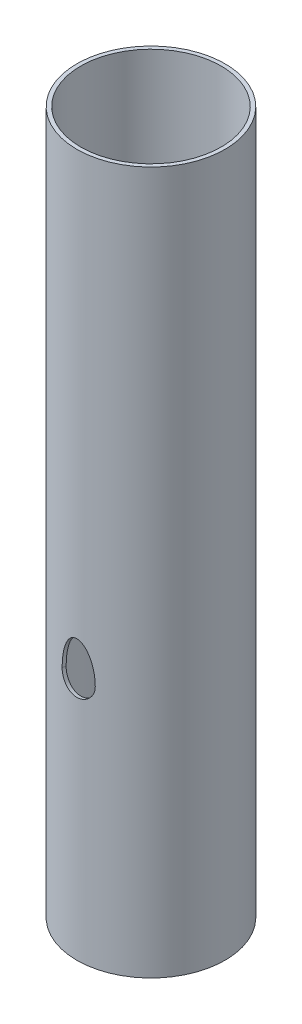
ISO-10303-21;
HEADER;
FILE_DESCRIPTION(('STEP AP214'),'2;1');
FILE_NAME('part.step','',(''),(''),'','','');
FILE_SCHEMA(('AUTOMOTIVE_DESIGN { 1 0 10303 214 1 1 1 1 }'));
ENDSEC;
DATA;
#1=APPLICATION_CONTEXT('core data for automotive mechanical design processes');
#2=APPLICATION_PROTOCOL_DEFINITION('international standard','automotive_design',2000,#1);
#3=PRODUCT_CONTEXT('',#1,'mechanical');
#4=PRODUCT('Part','Part','',(#3));
#5=PRODUCT_RELATED_PRODUCT_CATEGORY('part','',(#4));
#6=PRODUCT_DEFINITION_FORMATION('','',#4);
#7=PRODUCT_DEFINITION_CONTEXT('part definition',#1,'design');
#8=PRODUCT_DEFINITION('design','',#6,#7);
#9=PRODUCT_DEFINITION_SHAPE('','',#8);
#10=(LENGTH_UNIT() NAMED_UNIT(*) SI_UNIT(.MILLI.,.METRE.));
#11=(NAMED_UNIT(*) PLANE_ANGLE_UNIT() SI_UNIT($,.RADIAN.));
#12=(NAMED_UNIT(*) SI_UNIT($,.STERADIAN.) SOLID_ANGLE_UNIT());
#13=UNCERTAINTY_MEASURE_WITH_UNIT(LENGTH_MEASURE(1.E-05),#10,'distance_accuracy_value','');
#14=(GEOMETRIC_REPRESENTATION_CONTEXT(3) GLOBAL_UNCERTAINTY_ASSIGNED_CONTEXT((#13)) GLOBAL_UNIT_ASSIGNED_CONTEXT((#10,
#11,#12)) REPRESENTATION_CONTEXT('',''));
#15=CARTESIAN_POINT('',(0.,0.,0.));
#16=DIRECTION('',(0.,0.,1.));
#17=DIRECTION('',(1.,0.,0.));
#18=AXIS2_PLACEMENT_3D('',#15,#16,#17);
#19=CARTESIAN_POINT('',(0.,360.,0.));
#20=DIRECTION('',(0.,-1.,0.));
#21=DIRECTION('',(0.,0.,-1.));
#22=AXIS2_PLACEMENT_3D('',#19,#20,#21);
#23=CYLINDRICAL_SURFACE('',#22,38.);
#24=CARTESIAN_POINT('',(0.,0.,0.));
#25=DIRECTION('',(0.,1.,0.));
#26=DIRECTION('',(0.,0.,1.));
#27=AXIS2_PLACEMENT_3D('',#24,#25,#26);
#28=CIRCLE('',#27,38.);
#29=CARTESIAN_POINT('',(0.,0.,38.));
#30=VERTEX_POINT('',#29);
#31=EDGE_CURVE('E46',#30,#30,#28,.T.);
#32=ORIENTED_EDGE('',*,*,#31,.T.);
#33=EDGE_LOOP('',(#32));
#34=FACE_BOUND('',#33,.T.);
#35=CARTESIAN_POINT('',(0.,360.,0.));
#36=DIRECTION('',(0.,1.,0.));
#37=DIRECTION('',(0.,0.,1.));
#38=AXIS2_PLACEMENT_3D('',#35,#36,#37);
#39=CIRCLE('',#38,38.);
#40=CARTESIAN_POINT('',(0.,360.,38.));
#41=VERTEX_POINT('',#40);
#42=EDGE_CURVE('E11',#41,#41,#39,.T.);
#43=ORIENTED_EDGE('',*,*,#42,.F.);
#44=EDGE_LOOP('',(#43));
#45=FACE_BOUND('',#44,.T.);
#46=CARTESIAN_POINT('',(-8.5,125.220178982636,37.0371435183654));
#47=CARTESIAN_POINT('',(-8.49998518428324,125.576591605887,37.0371415842795));
#48=CARTESIAN_POINT('',(-8.49462946922596,125.933005976418,37.0383758416819));
#49=CARTESIAN_POINT('',(-8.47314102357249,126.646693600188,37.0433004704856));
#50=CARTESIAN_POINT('',(-8.45697206973296,127.003965705049,37.046999097117));
#51=CARTESIAN_POINT('',(-8.41370991508768,127.718665349382,37.0568475590352));
#52=CARTESIAN_POINT('',(-8.38659091984916,128.076091251212,37.0630031817421));
#53=CARTESIAN_POINT('',(-8.32121130547367,128.79039006131,37.0777369334471));
#54=CARTESIAN_POINT('',(-8.28293483536994,129.147261451611,37.0863185083685));
#55=CARTESIAN_POINT('',(-8.19496968954317,129.859737463081,37.1058553542909));
#56=CARTESIAN_POINT('',(-8.145274578652,130.215341254678,37.1168119635848));
#57=CARTESIAN_POINT('',(-8.03136389778806,130.942185632876,37.1416311676363));
#58=CARTESIAN_POINT('',(-7.96655142994299,131.313329125202,37.1556107433843));
#59=CARTESIAN_POINT('',(-7.82343536953696,132.052677776272,37.1860082655535));
#60=CARTESIAN_POINT('',(-7.74514004664882,132.420884592223,37.202424716477));
#61=CARTESIAN_POINT('',(-7.57436282661043,133.153529281874,37.237570123043));
#62=CARTESIAN_POINT('',(-7.4818943848007,133.517970383927,37.2562968821238));
#63=CARTESIAN_POINT('',(-7.28185530798081,134.242193869,37.2959109658544));
#64=CARTESIAN_POINT('',(-7.17429960784488,134.601980479404,37.3167961485632));
#65=CARTESIAN_POINT('',(-6.94285670661782,135.315952001793,37.3605491280686));
#66=CARTESIAN_POINT('',(-6.81897884800158,135.670139989403,37.3834157881634));
#67=CARTESIAN_POINT('',(-6.58639355997772,136.284209230262,37.4249870817385));
#68=CARTESIAN_POINT('',(-6.48159703793754,136.545599097338,37.4433090935282));
#69=CARTESIAN_POINT('',(-6.26105602418094,137.063704557463,37.4808178145711));
#70=CARTESIAN_POINT('',(-6.14531060855672,137.320419753863,37.5000045967252));
#71=CARTESIAN_POINT('',(-5.90182722516737,137.828259850538,37.5390950116048));
#72=CARTESIAN_POINT('',(-5.77408200981569,138.079381257561,37.5589990730186));
#73=CARTESIAN_POINT('',(-5.50698817140236,138.571718781238,37.5990840431626));
#74=CARTESIAN_POINT('',(-5.36778643025728,138.81301460149,37.6192593094497));
#75=CARTESIAN_POINT('',(-5.07527425790134,139.286766490383,37.6598379450906));
#76=CARTESIAN_POINT('',(-4.92197032700905,139.51922656267,37.6802412055794));
#77=CARTESIAN_POINT('',(-4.5997675717443,139.972810613979,37.7209292585137));
#78=CARTESIAN_POINT('',(-4.43088721002998,140.193947542598,37.7412141616669));
#79=CARTESIAN_POINT('',(-4.15248942202622,140.529233123075,37.7725705141218));
#80=CARTESIAN_POINT('',(-4.04888510062779,140.64829164134,37.7838326095901));
#81=CARTESIAN_POINT('',(-3.83569771543366,140.880969008416,37.8060698497677));
#82=CARTESIAN_POINT('',(-3.72611513039007,140.994588291448,37.817045017351));
#83=CARTESIAN_POINT('',(-3.50045584576793,141.215629809655,37.8386003235881));
#84=CARTESIAN_POINT('',(-3.38436882451714,141.323041612424,37.8491797872599));
#85=CARTESIAN_POINT('',(-3.14556802814393,141.53032962294,37.8697737494882));
#86=CARTESIAN_POINT('',(-3.02285407837896,141.630205631926,37.8797882331413));
#87=CARTESIAN_POINT('',(-2.76913172687769,141.822172414084,37.8991857804021));
#88=CARTESIAN_POINT('',(-2.63804340760504,141.91415904131,37.908560137966));
#89=CARTESIAN_POINT('',(-2.36882940863306,142.087392363364,37.9263343671421));
#90=CARTESIAN_POINT('',(-2.23070318835505,142.16863823147,37.9347341637357));
#91=CARTESIAN_POINT('',(-1.94797470741496,142.318364965582,37.9503015887688));
#92=CARTESIAN_POINT('',(-1.80338724253493,142.386873311019,37.9574718670607));
#93=CARTESIAN_POINT('',(-1.5081242123874,142.509364232648,37.9703484092714));
#94=CARTESIAN_POINT('',(-1.35745140347143,142.563353302317,37.9760553275973));
#95=CARTESIAN_POINT('',(-1.09259380954297,142.642566069218,37.984454041546));
#96=CARTESIAN_POINT('',(-0.979558937957618,142.671620452982,37.987543858935));
#97=CARTESIAN_POINT('',(-0.751480170559897,142.720402464916,37.9927397915642));
#98=CARTESIAN_POINT('',(-0.636436747664603,142.740132258671,37.9948461352093));
#99=CARTESIAN_POINT('',(-0.405139891885508,142.76980190481,37.9980161487457));
#100=CARTESIAN_POINT('',(-0.288887165009633,142.77974717735,37.9990803959069));
#101=CARTESIAN_POINT('',(-0.0559453442790437,142.789623891365,38.0001373009908));
#102=CARTESIAN_POINT('',(0.0607437638376682,142.789555002641,38.0001299235787));
#103=CARTESIAN_POINT('',(0.293677866016365,142.779403824345,37.9990436594827));
#104=CARTESIAN_POINT('',(0.409922860535451,142.769321545081,37.9979647739021));
#105=CARTESIAN_POINT('',(0.641124292199,142.739392169428,37.994767114632));
#106=CARTESIAN_POINT('',(0.756080754093572,142.719545260927,37.9926483609513));
#107=CARTESIAN_POINT('',(0.984027176658222,142.670532748988,37.9874281354272));
#108=CARTESIAN_POINT('',(1.09701596461412,142.641361776285,37.9843260973679));
#109=CARTESIAN_POINT('',(1.32036230570385,142.574322819434,37.9772186624842));
#110=CARTESIAN_POINT('',(1.43071922160604,142.536452752182,37.973213049292));
#111=CARTESIAN_POINT('',(1.68351215155167,142.439186382691,37.9629627640067));
#112=CARTESIAN_POINT('',(1.82478658586459,142.376788781488,37.9564128639352));
#113=CARTESIAN_POINT('',(2.10117970723585,142.239770234154,37.9421166915175));
#114=CARTESIAN_POINT('',(2.23629641934704,142.165145401198,37.9343700387892));
#115=CARTESIAN_POINT('',(2.63235894131371,141.925220999883,37.9096395049639));
#116=CARTESIAN_POINT('',(2.88367488847178,141.744010466581,37.8911798861519));
#117=CARTESIAN_POINT('',(3.31259662357637,141.390582956882,37.8558231999166));
#118=CARTESIAN_POINT('',(3.494891795167,141.223815714852,37.8393520092066));
#119=CARTESIAN_POINT('',(3.84433644825393,140.875003986192,37.8054477377606));
#120=CARTESIAN_POINT('',(4.01147574473991,140.692949382138,37.7880140226659));
#121=CARTESIAN_POINT('',(4.3319347070874,140.316751515782,37.7526207516692));
#122=CARTESIAN_POINT('',(4.48523340145227,140.122590638154,37.7346604506652));
#123=CARTESIAN_POINT('',(4.77900650389742,139.724931831905,37.6985806236962));
#124=CARTESIAN_POINT('',(4.91948384788433,139.52143605696,37.68046113523));
#125=CARTESIAN_POINT('',(5.18077355299153,139.119295242079,37.6453967597358));
#126=CARTESIAN_POINT('',(5.30225916568009,138.921085393589,37.6284463032257));
#127=CARTESIAN_POINT('',(5.53582578128208,138.519150978817,37.5947942191395));
#128=CARTESIAN_POINT('',(5.64790509870255,138.315425432803,37.5780926365976));
#129=CARTESIAN_POINT('',(5.86321492877277,137.903724473188,37.5451002916576));
#130=CARTESIAN_POINT('',(5.96645850109092,137.695755914841,37.5288089489707));
#131=CARTESIAN_POINT('',(6.164925397528,137.275978988159,37.4967168719166));
#132=CARTESIAN_POINT('',(6.26014778965048,137.064170177084,37.480916194695));
#133=CARTESIAN_POINT('',(6.53421110010771,136.424840508672,37.4344565806665));
#134=CARTESIAN_POINT('',(6.70193954029941,135.992460640914,37.4046630639946));
#135=CARTESIAN_POINT('',(7.01117618208541,135.118248048092,37.3479319219331));
#136=CARTESIAN_POINT('',(7.15267754196538,134.676412889913,37.3209950425206));
#137=CARTESIAN_POINT('',(7.41185995135212,133.786137015376,37.2703868166038));
#138=CARTESIAN_POINT('',(7.52956451528366,133.337703294132,37.2467122539339));
#139=CARTESIAN_POINT('',(7.74320874413381,132.435595231623,37.2028840980373));
#140=CARTESIAN_POINT('',(7.83915071486402,131.981921450916,37.1827301318449));
#141=CARTESIAN_POINT('',(8.01064187950691,131.070784315021,37.1461611199915));
#142=CARTESIAN_POINT('',(8.08619867524256,130.613322438224,37.1297446809291));
#143=CARTESIAN_POINT('',(8.21796554496378,129.695459589159,37.1008031351869));
#144=CARTESIAN_POINT('',(8.27417390516383,129.235058360216,37.0882783732215));
#145=CARTESIAN_POINT('',(8.3510024993311,128.478608833925,37.0710355264662));
#146=CARTESIAN_POINT('',(8.37714771461771,128.183134488609,37.0651307778466));
#147=CARTESIAN_POINT('',(8.42190312848705,127.591575767788,37.0549872116097));
#148=CARTESIAN_POINT('',(8.44051314025518,127.295491377342,37.0507484352956));
#149=CARTESIAN_POINT('',(8.47027081481158,126.702961286183,37.0439570842131));
#150=CARTESIAN_POINT('',(8.48141925714616,126.406515626457,37.0414043332979));
#151=CARTESIAN_POINT('',(8.4962801918651,125.81343966434,37.0379971317713));
#152=CARTESIAN_POINT('',(8.49999297358287,125.516809369584,37.0371426150788));
#153=CARTESIAN_POINT('',(8.5,125.220178982636,37.0371435183654));
#154=B_SPLINE_CURVE_WITH_KNOTS('',3,(#46,#47,#48,#49,#50,#51,#52,#53,#54,#55,#56,#57,#58,#59,
#60,#61,#62,#63,#64,#65,#66,#67,#68,#69,#70,#71,#72,#73,#74,#75,#76,#77,#78,#79,#80,#81,#82,#83,
#84,#85,#86,#87,#88,#89,#90,#91,#92,#93,#94,#95,#96,#97,#98,#99,#100,#101,#102,#103,#104,#105,
#106,#107,#108,#109,#110,#111,#112,#113,#114,#115,#116,#117,#118,#119,#120,#121,#122,#123,#124,
#125,#126,#127,#128,#129,#130,#131,#132,#133,#134,#135,#136,#137,#138,#139,#140,#141,#142,#143,
#144,#145,#146,#147,#148,#149,#150,#151,#152,#153),.UNSPECIFIED.,.F.,.F.,(4,2,2,2,2,2,2,2,2,2,2,
2,2,2,2,2,2,2,2,2,2,2,2,2,2,2,2,2,2,2,2,2,2,2,2,2,2,2,2,2,2,2,2,2,2,2,2,2,2,2,2,2,2,4),(0.,
1.06919865003543,2.14199706776149,3.21733750217294,4.29421313672656,5.37169715777696,
6.5025054820033,7.63262268237066,8.76167356908135,9.88961459381528,11.0169127898853,
11.8633249749535,12.7098086472085,13.556806903098,14.3942661432294,15.2313412776563,
16.0674366786977,16.541945431992,17.016416241235,17.4916625576879,17.9669214046455,
18.4477119656175,18.9285395117751,19.4083173878365,19.8878803339587,20.2377731057702,
20.5875845769529,20.9372021600678,21.2868312711734,21.6364600223282,21.9860820462727,
22.3359057639236,22.6858133385883,23.1488275742389,23.6119892806981,24.5394079955643,
25.2813426108297,26.0237721800796,26.7673084454581,27.5106740222036,28.209679674681,
28.9088103141703,29.6068890840605,30.3050488535131,31.6981436658108,33.091601377193,
34.4836753623451,35.8756017841431,37.2670084238285,38.6585382755091,39.5485102637729,
40.4385043150894,41.3284053698961,42.2182717965607),.UNSPECIFIED.);
#155=CARTESIAN_POINT('',(-8.5,125.220178982636,37.0371435183655));
#156=VERTEX_POINT('',#155);
#157=CARTESIAN_POINT('',(8.5,125.220178982636,37.0371435183654));
#158=VERTEX_POINT('',#157);
#159=EDGE_CURVE('E72',#156,#158,#154,.T.);
#160=ORIENTED_EDGE('',*,*,#159,.T.);
#161=CARTESIAN_POINT('',(8.5,125.220178982636,37.0371435183654));
#162=CARTESIAN_POINT('',(8.50002673091964,124.982763444022,37.0371204150631));
#163=CARTESIAN_POINT('',(8.49047006415286,124.745333666116,37.0393299994885));
#164=CARTESIAN_POINT('',(8.4521517466582,124.272089773955,37.0481019067337));
#165=CARTESIAN_POINT('',(8.42338831531766,124.036275811546,37.0546646331225));
#166=CARTESIAN_POINT('',(8.34663776514487,123.568071316263,37.0720257378599));
#167=CARTESIAN_POINT('',(8.29866042142096,123.335679104803,37.0828219623515));
#168=CARTESIAN_POINT('',(8.18365414625002,122.875891839409,37.1083723030173));
#169=CARTESIAN_POINT('',(8.11662632479467,122.648496495159,37.1231261885922));
#170=CARTESIAN_POINT('',(7.96375819321486,122.200081550656,37.1562197544927));
#171=CARTESIAN_POINT('',(7.87789555633679,121.97906987246,37.1745636876474));
#172=CARTESIAN_POINT('',(7.68791350329246,121.545320125058,37.2143171235103));
#173=CARTESIAN_POINT('',(7.58379386827088,121.332582155068,37.2357266629668));
#174=CARTESIAN_POINT('',(7.35802132957639,120.917006243011,37.2809973565596));
#175=CARTESIAN_POINT('',(7.23637534279722,120.714164437433,37.3048575424698));
#176=CARTESIAN_POINT('',(6.97635424181037,120.319737032556,37.3543570111086));
#177=CARTESIAN_POINT('',(6.83797935962245,120.128151277197,37.3799962691603));
#178=CARTESIAN_POINT('',(6.54695791088309,119.759446716931,37.4320579514528));
#179=CARTESIAN_POINT('',(6.39447026169919,119.582200931509,37.4584698000901));
#180=CARTESIAN_POINT('',(6.0750656225447,119.24116071839,37.5115953915083));
#181=CARTESIAN_POINT('',(5.9081437136981,119.077370913567,37.5383092344849));
#182=CARTESIAN_POINT('',(5.56106937165703,118.764359833238,37.5912931283765));
#183=CARTESIAN_POINT('',(5.38091585033319,118.61513975826,37.6175631425733));
#184=CARTESIAN_POINT('',(5.00864391399015,118.332224690238,37.6689366293506));
#185=CARTESIAN_POINT('',(4.81652519407412,118.198530093061,37.6940400721761));
#186=CARTESIAN_POINT('',(4.42007469607837,117.946490622022,37.7425904523673));
#187=CARTESIAN_POINT('',(4.21565720859801,117.828277678048,37.7660224633142));
#188=CARTESIAN_POINT('',(3.79745814516996,117.609205714987,37.8103626204361));
#189=CARTESIAN_POINT('',(3.58367632339421,117.508347151822,37.8312707002999));
#190=CARTESIAN_POINT('',(3.14830386615148,117.324627948724,37.8699871676037));
#191=CARTESIAN_POINT('',(2.92671510018438,117.241763033511,37.8877962911538));
#192=CARTESIAN_POINT('',(2.47715799430309,117.094481273131,37.9198428726028));
#193=CARTESIAN_POINT('',(2.2491875944411,117.030070461988,37.9340791620873));
#194=CARTESIAN_POINT('',(1.78690075943506,116.919734906839,37.9586740715925));
#195=CARTESIAN_POINT('',(1.55255085221006,116.873944083176,37.9690045639904));
#196=CARTESIAN_POINT('',(1.08073099610526,116.80178694362,37.9853621749116));
#197=CARTESIAN_POINT('',(0.843261039466376,116.775420676044,37.9913892827311));
#198=CARTESIAN_POINT('',(0.366839079653806,116.742271245788,37.9989762757044));
#199=CARTESIAN_POINT('',(0.127886788493933,116.735492015983,38.0005352637058));
#200=CARTESIAN_POINT('',(-0.349676667170343,116.741568546255,37.9991411122861));
#201=CARTESIAN_POINT('',(-0.588287917538466,116.754417900608,37.9961894449025));
#202=CARTESIAN_POINT('',(-1.06373398518762,116.79967807005,37.985853326183));
#203=CARTESIAN_POINT('',(-1.30056731809451,116.832103712111,37.9784655149594));
#204=CARTESIAN_POINT('',(-1.77058582755575,116.916328671133,37.9594566211902));
#205=CARTESIAN_POINT('',(-2.00377108148225,116.968127576624,37.9478356285535));
#206=CARTESIAN_POINT('',(-2.46484860092984,117.090782122818,37.9206785136621));
#207=CARTESIAN_POINT('',(-2.69274071729321,117.161638299837,37.9051422812238));
#208=CARTESIAN_POINT('',(-3.14160223164884,117.321968335391,37.8705823431925));
#209=CARTESIAN_POINT('',(-3.3625717459839,117.411441880844,37.8515586962466));
#210=CARTESIAN_POINT('',(-3.79609702971819,117.608487573229,37.8105418651937));
#211=CARTESIAN_POINT('',(-4.00864981020022,117.716066079572,37.7885476382013));
#212=CARTESIAN_POINT('',(-4.42367011636329,117.948585876293,37.7422141788104));
#213=CARTESIAN_POINT('',(-4.62614115459258,118.073521061167,37.717875771936));
#214=CARTESIAN_POINT('',(-5.01965911591654,118.340011786737,37.6675242553559));
#215=CARTESIAN_POINT('',(-5.21070430103012,118.481569846275,37.6415108921168));
#216=CARTESIAN_POINT('',(-5.57996284982549,118.780377637754,37.5885462821266));
#217=CARTESIAN_POINT('',(-5.75817628316387,118.937627284502,37.5615950404679));
#218=CARTESIAN_POINT('',(-6.09989712321285,119.266215553379,37.5076136631223));
#219=CARTESIAN_POINT('',(-6.26345298449465,119.437503877022,37.4805841172661));
#220=CARTESIAN_POINT('',(-6.57537076299011,119.79348473845,37.427123128314));
#221=CARTESIAN_POINT('',(-6.72373275070674,119.97817721403,37.4006916824434));
#222=CARTESIAN_POINT('',(-7.0042168913422,120.359710560299,37.3491805495987));
#223=CARTESIAN_POINT('',(-7.13633764047524,120.556552478901,37.324100979577));
#224=CARTESIAN_POINT('',(-7.38339341594011,120.960973813481,37.2760157096848));
#225=CARTESIAN_POINT('',(-7.49832902005031,121.168552868152,37.2530099401019));
#226=CARTESIAN_POINT('',(-7.70920906315997,121.59088904321,37.2099391447607));
#227=CARTESIAN_POINT('',(-7.80532743360157,121.805556649695,37.1898476793184));
#228=CARTESIAN_POINT('',(-7.97935370888124,122.242414416252,37.1528980410719));
#229=CARTESIAN_POINT('',(-8.05726200860818,122.464604413079,37.136039798156));
#230=CARTESIAN_POINT('',(-8.19438354197862,122.914722192187,37.1060238645032));
#231=CARTESIAN_POINT('',(-8.25361172767215,123.14264522699,37.0928632150423));
#232=CARTESIAN_POINT('',(-8.35318012832894,123.60268626421,37.0705675595952));
#233=CARTESIAN_POINT('',(-8.39352780678938,123.834802571269,37.061430962978));
#234=CARTESIAN_POINT('',(-8.44966398654964,124.259241497194,37.0486689763602));
#235=CARTESIAN_POINT('',(-8.46858160348136,124.451136788419,37.0443441123194));
#236=CARTESIAN_POINT('',(-8.49374155851819,124.835413446049,37.0385796522273));
#237=CARTESIAN_POINT('',(-8.50000927677692,125.027793062235,37.0371342789784));
#238=CARTESIAN_POINT('',(-8.5,125.220178982636,37.0371435183655));
#239=B_SPLINE_CURVE_WITH_KNOTS('',3,(#161,#162,#163,#164,#165,#166,#167,#168,#169,#170,#171,
#172,#173,#174,#175,#176,#177,#178,#179,#180,#181,#182,#183,#184,#185,#186,#187,#188,#189,#190,
#191,#192,#193,#194,#195,#196,#197,#198,#199,#200,#201,#202,#203,#204,#205,#206,#207,#208,#209,
#210,#211,#212,#213,#214,#215,#216,#217,#218,#219,#220,#221,#222,#223,#224,#225,#226,#227,#228,
#229,#230,#231,#232,#233,#234,#235,#236,#237,#238),.UNSPECIFIED.,.F.,.F.,(4,2,2,2,2,2,2,2,2,2,2,
2,2,2,2,2,2,2,2,2,2,2,2,2,2,2,2,2,2,2,2,2,2,2,2,2,2,2,4),(0.,0.712064789632464,1.42419560223477,
2.1359645764741,2.84769208740983,3.56026788231925,4.27285221979755,4.98515609747527,
5.69745009705789,6.40252248496277,7.10783610000996,7.81320778308476,8.51859744777887,
9.22965344198192,9.94072811368891,10.6516336491527,11.3627713681065,12.0789369876835,
12.7951043885895,13.5114155784438,14.2274930524052,14.9441135610571,15.6607188502363,
16.3773443085211,17.0939577165701,17.8108233641728,18.5274374777511,19.244160319372,
19.9608792700021,20.6751340501438,21.3893855158332,22.1036986733766,22.8179878097356,
23.5253256895435,24.2326482291707,24.9394031640596,25.6458784809962,26.2240737564479,
26.8011078106178),.UNSPECIFIED.);
#240=EDGE_CURVE('E82',#158,#156,#239,.T.);
#241=ORIENTED_EDGE('',*,*,#240,.T.);
#242=EDGE_LOOP('',(#160,#241));
#243=FACE_BOUND('',#242,.T.);
#244=ADVANCED_FACE('F43',(#34,#45,#243),#23,.T.);
#245=CARTESIAN_POINT('',(0.,360.,0.));
#246=DIRECTION('',(0.,-1.,0.));
#247=DIRECTION('',(0.,0.,-1.));
#248=AXIS2_PLACEMENT_3D('',#245,#246,#247);
#249=CYLINDRICAL_SURFACE('',#248,36.);
#250=CARTESIAN_POINT('',(0.,360.,0.));
#251=DIRECTION('',(0.,1.,0.));
#252=DIRECTION('',(0.,0.,1.));
#253=AXIS2_PLACEMENT_3D('',#250,#251,#252);
#254=CIRCLE('',#253,36.);
#255=CARTESIAN_POINT('',(0.,360.,36.));
#256=VERTEX_POINT('',#255);
#257=EDGE_CURVE('E141',#256,#256,#254,.T.);
#258=ORIENTED_EDGE('',*,*,#257,.T.);
#259=EDGE_LOOP('',(#258));
#260=FACE_BOUND('',#259,.T.);
#261=CARTESIAN_POINT('',(0.,0.,0.));
#262=DIRECTION('',(0.,1.,0.));
#263=DIRECTION('',(0.,0.,1.));
#264=AXIS2_PLACEMENT_3D('',#261,#262,#263);
#265=CIRCLE('',#264,36.);
#266=CARTESIAN_POINT('',(0.,0.,36.));
#267=VERTEX_POINT('',#266);
#268=EDGE_CURVE('E138',#267,#267,#265,.T.);
#269=ORIENTED_EDGE('',*,*,#268,.F.);
#270=EDGE_LOOP('',(#269));
#271=FACE_BOUND('',#270,.T.);
#272=CARTESIAN_POINT('',(8.5,124.790866025015,34.9821382994236));
#273=CARTESIAN_POINT('',(8.50002706190632,124.554244830123,34.9821138646801));
#274=CARTESIAN_POINT('',(8.49053375566825,124.317608796719,34.9844377485103));
#275=CARTESIAN_POINT('',(8.45245962967467,123.8459472122,34.9936657942365));
#276=CARTESIAN_POINT('',(8.42387703560209,123.610921812842,35.0005703819008));
#277=CARTESIAN_POINT('',(8.34760018639274,123.144304836312,35.0188380125043));
#278=CARTESIAN_POINT('',(8.29991728898204,122.912711303146,35.0301984057781));
#279=CARTESIAN_POINT('',(8.18560614728707,122.45450738662,35.0570865827512));
#280=CARTESIAN_POINT('',(8.11897902664745,122.227896708569,35.0726141192804));
#281=CARTESIAN_POINT('',(7.96701511896195,121.781031368172,35.1074456721362));
#282=CARTESIAN_POINT('',(7.88165613437949,121.560784600568,35.1267541660054));
#283=CARTESIAN_POINT('',(7.69278098973652,121.128533770409,35.168600646988));
#284=CARTESIAN_POINT('',(7.5892645835136,120.916529819652,35.191138677884));
#285=CARTESIAN_POINT('',(7.36479300480618,120.502373607422,35.2387992864048));
#286=CARTESIAN_POINT('',(7.24384438326569,120.300217683122,35.2639208921232));
#287=CARTESIAN_POINT('',(6.98531000334219,119.907101022945,35.3160420254393));
#288=CARTESIAN_POINT('',(6.84772446118026,119.716140141619,35.343041528629));
#289=CARTESIAN_POINT('',(6.55822768674918,119.348432169575,35.3978974602899));
#290=CARTESIAN_POINT('',(6.40646053965634,119.171570066801,35.4257436681043));
#291=CARTESIAN_POINT('',(6.08854668729766,118.831223049606,35.4817650626314));
#292=CARTESIAN_POINT('',(5.92239508375172,118.667742729189,35.5099403585593));
#293=CARTESIAN_POINT('',(5.57690017015396,118.35525682309,35.5658375736076));
#294=CARTESIAN_POINT('',(5.39755566328171,118.206252553486,35.5935594513157));
#295=CARTESIAN_POINT('',(5.02692989572093,117.923659742865,35.6477916085452));
#296=CARTESIAN_POINT('',(4.83564831623724,117.790071613829,35.6743018556756));
#297=CARTESIAN_POINT('',(4.44044818575281,117.53783730178,35.7256563914079));
#298=CARTESIAN_POINT('',(4.23641981714584,117.419359091185,35.7504807209155));
#299=CARTESIAN_POINT('',(3.81895898455381,117.199696888352,35.7974813210688));
#300=CARTESIAN_POINT('',(3.60552625940676,117.098513376774,35.8196575181116));
#301=CARTESIAN_POINT('',(3.17080806735889,116.914080266203,35.8607532867024));
#302=CARTESIAN_POINT('',(2.94952454729267,116.830826256771,35.8796736589128));
#303=CARTESIAN_POINT('',(2.50052321747736,116.682696784538,35.9137590446837));
#304=CARTESIAN_POINT('',(2.27280321064024,116.617827682801,35.928922758236));
#305=CARTESIAN_POINT('',(1.81084846963138,116.506476208965,35.9551769573639));
#306=CARTESIAN_POINT('',(1.57657746191284,116.46013678299,35.9662357304816));
#307=CARTESIAN_POINT('',(1.10485020831922,116.386833341639,35.9838160113312));
#308=CARTESIAN_POINT('',(0.867393887873849,116.359869780674,35.9903374126506));
#309=CARTESIAN_POINT('',(0.390982120521902,116.325483942142,35.99866514901));
#310=CARTESIAN_POINT('',(0.152026635840241,116.318062158976,36.0004713647573));
#311=CARTESIAN_POINT('',(-0.325677864100173,116.32280671811,35.9993192269585));
#312=CARTESIAN_POINT('',(-0.564426879681907,116.334973029713,35.996360880879));
#313=CARTESIAN_POINT('',(-1.04003994470627,116.378821054322,35.9857597200728));
#314=CARTESIAN_POINT('',(-1.27690384582954,116.410504287825,35.9781165403667));
#315=CARTESIAN_POINT('',(-1.74703987195645,116.493193058934,35.9583537955618));
#316=CARTESIAN_POINT('',(-1.98031207038683,116.544198200986,35.9462343221007));
#317=CARTESIAN_POINT('',(-2.44165872503069,116.665231198477,35.9178469306404));
#318=CARTESIAN_POINT('',(-2.66973216248218,116.735262748225,35.9015782070292));
#319=CARTESIAN_POINT('',(-3.11893819958599,116.893888695445,35.8653452009216));
#320=CARTESIAN_POINT('',(-3.34007316761354,116.98247667784,35.8453821958391));
#321=CARTESIAN_POINT('',(-3.77404689183129,117.177746274826,35.8022925452401));
#322=CARTESIAN_POINT('',(-3.98688056300774,117.284438771848,35.779163998577));
#323=CARTESIAN_POINT('',(-4.40259119521322,117.515218653415,35.7303931502276));
#324=CARTESIAN_POINT('',(-4.60546837291165,117.6393056592,35.7047509032799));
#325=CARTESIAN_POINT('',(-4.999823092918,117.904101552921,35.6516669999184));
#326=CARTESIAN_POINT('',(-5.19130055102531,118.044810563607,35.6242253302169));
#327=CARTESIAN_POINT('',(-5.56147450367366,118.341950936615,35.5683152104073));
#328=CARTESIAN_POINT('',(-5.74017132371185,118.498381898287,35.5398467864762));
#329=CARTESIAN_POINT('',(-6.08300901144514,118.825483197195,35.4827721947975));
#330=CARTESIAN_POINT('',(-6.24718994670587,118.996111642962,35.4541666516208));
#331=CARTESIAN_POINT('',(-6.56032762772874,119.3507936178,35.3975622869296));
#332=CARTESIAN_POINT('',(-6.70928985065715,119.534842275821,35.3695632500146));
#333=CARTESIAN_POINT('',(-6.99102280915017,119.915206576714,35.314957213138));
#334=CARTESIAN_POINT('',(-7.12378962091089,120.111525174976,35.2883505514073));
#335=CARTESIAN_POINT('',(-7.3721460749611,120.515002252912,35.2373032796866));
#336=CARTESIAN_POINT('',(-7.48773631783482,120.722160353237,35.2128625939745));
#337=CARTESIAN_POINT('',(-7.69974804861139,121.143433508028,35.1671084203026));
#338=CARTESIAN_POINT('',(-7.79637128376922,121.357443567153,35.1457627313849));
#339=CARTESIAN_POINT('',(-7.97144957147435,121.793067870414,35.1064673079132));
#340=CARTESIAN_POINT('',(-8.04990495647714,122.014681975318,35.0885175112184));
#341=CARTESIAN_POINT('',(-8.18815582177466,122.463734229315,35.0565135469638));
#342=CARTESIAN_POINT('',(-8.24796583287553,122.691167692897,35.0424563467657));
#343=CARTESIAN_POINT('',(-8.34872665018176,123.150306248262,35.0185870271181));
#344=CARTESIAN_POINT('',(-8.38968481743569,123.382009635956,35.0087732508365));
#345=CARTESIAN_POINT('',(-8.44752465015343,123.809969163599,34.9948580439242));
#346=CARTESIAN_POINT('',(-8.46724825375659,124.00582571449,34.9900849108244));
#347=CARTESIAN_POINT('',(-8.49347794429566,124.398076572852,34.9837228135829));
#348=CARTESIAN_POINT('',(-8.50001067141092,124.594468992728,34.9821274317709));
#349=CARTESIAN_POINT('',(-8.5,124.790866025015,34.9821382994236));
#350=B_SPLINE_CURVE_WITH_KNOTS('',3,(#272,#273,#274,#275,#276,#277,#278,#279,#280,#281,#282,
#283,#284,#285,#286,#287,#288,#289,#290,#291,#292,#293,#294,#295,#296,#297,#298,#299,#300,#301,
#302,#303,#304,#305,#306,#307,#308,#309,#310,#311,#312,#313,#314,#315,#316,#317,#318,#319,#320,
#321,#322,#323,#324,#325,#326,#327,#328,#329,#330,#331,#332,#333,#334,#335,#336,#337,#338,#339,
#340,#341,#342,#343,#344,#345,#346,#347,#348,#349),.UNSPECIFIED.,.F.,.F.,(4,2,2,2,2,2,2,2,2,2,2,
2,2,2,2,2,2,2,2,2,2,2,2,2,2,2,2,2,2,2,2,2,2,2,2,2,2,2,4),(0.,0.709683350186264,1.4194326734234,
2.1287605792614,2.83804642128443,3.54817736047812,4.258317927749,4.9681923200266,
5.67805748744168,6.38136480208606,7.08491256026228,7.78852422106655,8.49215468078932,
9.20302847817746,9.91392202921571,10.6246405089077,11.335604593386,12.0519521906449,
12.7683165874465,13.4846991078714,14.2010805056214,14.9175177212874,15.6339402710181,
16.3505020262679,17.0668164691948,17.7835630163131,18.5002939589451,19.2170301948389,
19.9337481703975,20.6484216695953,21.3628370472263,22.0774251701806,22.7919883014496,
23.4984811832731,24.2049611358841,24.9108891266052,25.616541240452,26.2067971652864,
26.7958598172692),.UNSPECIFIED.);
#351=CARTESIAN_POINT('',(8.5,124.790866025015,34.9821382994236));
#352=VERTEX_POINT('',#351);
#353=CARTESIAN_POINT('',(-8.5,124.790866025015,34.9821382994236));
#354=VERTEX_POINT('',#353);
#355=EDGE_CURVE('E75',#352,#354,#350,.T.);
#356=ORIENTED_EDGE('',*,*,#355,.F.);
#357=CARTESIAN_POINT('',(-8.5,124.790866025015,34.9821382994236));
#358=CARTESIAN_POINT('',(-8.49998527983945,125.146960887959,34.9821362209467));
#359=CARTESIAN_POINT('',(-8.49463904711223,125.503057363811,34.9834406886273));
#360=CARTESIAN_POINT('',(-8.47319229205917,126.216086843694,34.9886444621747));
#361=CARTESIAN_POINT('',(-8.45705623454619,126.573018715623,34.9925523419553));
#362=CARTESIAN_POINT('',(-8.41388756921317,127.287021441854,35.0029564785661));
#363=CARTESIAN_POINT('',(-8.38682965887384,127.644090682074,35.0094587453745));
#364=CARTESIAN_POINT('',(-8.32160492429814,128.357665756184,35.025020004794));
#365=CARTESIAN_POINT('',(-8.28342255432296,128.714170094882,35.0340825747279));
#366=CARTESIAN_POINT('',(-8.19568334859841,129.425907686854,35.0547115983746));
#367=CARTESIAN_POINT('',(-8.14612020493558,129.781140123855,35.0662794404578));
#368=CARTESIAN_POINT('',(-8.03257258655933,130.506915268532,35.0924684668651));
#369=CARTESIAN_POINT('',(-7.96800413198639,130.877362671559,35.1072107548523));
#370=CARTESIAN_POINT('',(-7.82545341142991,131.61533256329,35.1392603225065));
#371=CARTESIAN_POINT('',(-7.74747922982273,131.982856675944,35.1565660554124));
#372=CARTESIAN_POINT('',(-7.57743177610543,132.71415842717,35.1936088033062));
#373=CARTESIAN_POINT('',(-7.48537165963631,133.07793922694,35.2133435463766));
#374=CARTESIAN_POINT('',(-7.28624964190015,133.800874687702,35.2550834555317));
#375=CARTESIAN_POINT('',(-7.17920235431667,134.160033487396,35.2770864044891));
#376=CARTESIAN_POINT('',(-6.94889412469599,134.872793040876,35.3231748546088));
#377=CARTESIAN_POINT('',(-6.82564236974018,135.226396817844,35.3472591731122));
#378=CARTESIAN_POINT('',(-6.59410317039653,135.839956342063,35.3910724379961));
#379=CARTESIAN_POINT('',(-6.4896787781379,136.101399860722,35.4104012662882));
#380=CARTESIAN_POINT('',(-6.2699331901907,136.619643659339,35.4499706098176));
#381=CARTESIAN_POINT('',(-6.15461112269037,136.876443565847,35.4702111979275));
#382=CARTESIAN_POINT('',(-5.91203404600091,137.38449547366,35.5114489290806));
#383=CARTESIAN_POINT('',(-5.78477194295774,137.635744065883,35.5324465172554));
#384=CARTESIAN_POINT('',(-5.5186835672792,138.128436520092,35.5747394458138));
#385=CARTESIAN_POINT('',(-5.38000135149454,138.369958262535,35.5960288932596));
#386=CARTESIAN_POINT('',(-5.08859485481646,138.844245120764,35.6388536676349));
#387=CARTESIAN_POINT('',(-4.93587692886161,139.077014132903,35.6603888794591));
#388=CARTESIAN_POINT('',(-4.61491672527705,139.531331217731,35.703343790178));
#389=CARTESIAN_POINT('',(-4.44669253548047,139.752891908779,35.7247635935686));
#390=CARTESIAN_POINT('',(-4.1690209087742,140.089397955544,35.7579295483328));
#391=CARTESIAN_POINT('',(-4.06544224393679,140.209184073295,35.7698709652468));
#392=CARTESIAN_POINT('',(-3.85228428401753,140.443334522829,35.7934548841509));
#393=CARTESIAN_POINT('',(-3.74270546702451,140.557699285231,35.8050974098482));
#394=CARTESIAN_POINT('',(-3.51702343858523,140.780252515712,35.8279699281155));
#395=CARTESIAN_POINT('',(-3.40090977402023,140.888430496225,35.839199209319));
#396=CARTESIAN_POINT('',(-3.16201774670486,141.097266974453,35.8610656601895));
#397=CARTESIAN_POINT('',(-3.03923921030903,141.197925276088,35.8717028144146));
#398=CARTESIAN_POINT('',(-2.7853305949696,141.391482239509,35.8923159465505));
#399=CARTESIAN_POINT('',(-2.65411964413411,141.484276397161,35.9022827382257));
#400=CARTESIAN_POINT('',(-2.3845952046694,141.659125019225,35.9211908109648));
#401=CARTESIAN_POINT('',(-2.24628114971321,141.741178625444,35.9301320100743));
#402=CARTESIAN_POINT('',(-1.96310298237246,141.892498528083,35.9467146468779));
#403=CARTESIAN_POINT('',(-1.81825404891811,141.961792731865,35.9543589182603));
#404=CARTESIAN_POINT('',(-1.52237907072472,142.08581051261,35.9681005112685));
#405=CARTESIAN_POINT('',(-1.37135588164187,142.140540739545,35.9741985388555));
#406=CARTESIAN_POINT('',(-1.10635652873614,142.220801693268,35.9831687061318));
#407=CARTESIAN_POINT('',(-0.993564846344923,142.250224205804,35.9864669307868));
#408=CARTESIAN_POINT('',(-0.765942051738475,142.299778980299,35.9920307993079));
#409=CARTESIAN_POINT('',(-0.651111426572456,142.319913430732,35.9942966864142));
#410=CARTESIAN_POINT('',(-0.420205091001189,142.350419755372,35.9977326010254));
#411=CARTESIAN_POINT('',(-0.304130119559717,142.360797130745,35.9989032460402));
#412=CARTESIAN_POINT('',(-0.0715048662221321,142.371555219647,36.0001168747738));
#413=CARTESIAN_POINT('',(0.0450454310769775,142.371935606607,36.0001598216542));
#414=CARTESIAN_POINT('',(0.277754181444326,142.362688323622,35.9991165664493));
#415=CARTESIAN_POINT('',(0.393912588274071,142.353059511472,35.9980302354959));
#416=CARTESIAN_POINT('',(0.624976336062568,142.324030468756,35.9947601352057));
#417=CARTESIAN_POINT('',(0.739881701069471,142.304630426056,35.9925763869683));
#418=CARTESIAN_POINT('',(0.967756184851769,142.256497434284,35.9871705760264));
#419=CARTESIAN_POINT('',(1.08072414693134,142.227759101065,35.9839479143273));
#420=CARTESIAN_POINT('',(1.30405280918446,142.161565945904,35.9765470733698));
#421=CARTESIAN_POINT('',(1.41441288022162,142.124109043841,35.9723686660889));
#422=CARTESIAN_POINT('',(1.66670217897593,142.027979718805,35.9616839619254));
#423=CARTESIAN_POINT('',(1.80749636440216,141.96634949976,35.9548600531541));
#424=CARTESIAN_POINT('',(2.08299534235404,141.830911121455,35.9399525155847));
#425=CARTESIAN_POINT('',(2.21769820662411,141.757099139871,35.9318684914389));
#426=CARTESIAN_POINT('',(2.61260500005017,141.519662875669,35.9060439220112));
#427=CARTESIAN_POINT('',(2.86326927572311,141.340174109799,35.8867461781783));
#428=CARTESIAN_POINT('',(3.29097348010849,140.990064945919,35.8497686752503));
#429=CARTESIAN_POINT('',(3.47268759236422,140.824907051996,35.8325427207721));
#430=CARTESIAN_POINT('',(3.82110189423996,140.479361253504,35.7970645299501));
#431=CARTESIAN_POINT('',(3.9877920130499,140.29896328792,35.7788116183394));
#432=CARTESIAN_POINT('',(4.30746605954461,139.926106677325,35.7417357340647));
#433=CARTESIAN_POINT('',(4.46042913282465,139.733630412018,35.7229119502784));
#434=CARTESIAN_POINT('',(4.75363015723341,139.339354673654,35.6850785788339));
#435=CARTESIAN_POINT('',(4.89387101193457,139.137557343878,35.6660690346741));
#436=CARTESIAN_POINT('',(5.15477137832744,138.738742453122,35.6292663909768));
#437=CARTESIAN_POINT('',(5.27610032348938,138.542160532422,35.6114685179373));
#438=CARTESIAN_POINT('',(5.50942650940183,138.143484878434,35.5761175553388));
#439=CARTESIAN_POINT('',(5.62142207709195,137.941390165528,35.558564510134));
#440=CARTESIAN_POINT('',(5.83663163492177,137.532947585761,35.5238735822349));
#441=CARTESIAN_POINT('',(5.93985858517415,137.326606576215,35.5067351145858));
#442=CARTESIAN_POINT('',(6.13835470440112,136.910081406196,35.4729575004705));
#443=CARTESIAN_POINT('',(6.23362294842519,136.699896802476,35.4563184121851));
#444=CARTESIAN_POINT('',(6.50791116455425,136.065425396326,35.4073679421139));
#445=CARTESIAN_POINT('',(6.67590630640311,135.636271810909,35.3759423095284));
#446=CARTESIAN_POINT('',(6.98588957101857,134.768478989944,35.3160327184057));
#447=CARTESIAN_POINT('',(7.12787090535535,134.329837311726,35.2875495285567));
#448=CARTESIAN_POINT('',(7.38821301811363,133.445904538907,35.2339600098439));
#449=CARTESIAN_POINT('',(7.50659710883808,133.000620478761,35.2088503562568));
#450=CARTESIAN_POINT('',(7.72179252911227,132.104765900631,35.1622811469371));
#451=CARTESIAN_POINT('',(7.81860617602009,131.654195956001,35.1408211991678));
#452=CARTESIAN_POINT('',(7.99202945520575,130.749215696462,35.1017855359789));
#453=CARTESIAN_POINT('',(8.06864667871245,130.294806890936,35.0842083615451));
#454=CARTESIAN_POINT('',(8.20272503014716,129.382993489292,35.0531031260803));
#455=CARTESIAN_POINT('',(8.26018434020507,128.925588613077,35.0395754493135));
#456=CARTESIAN_POINT('',(8.34048645929644,128.161995707911,35.0205275254173));
#457=CARTESIAN_POINT('',(8.36848030802623,127.856365945487,35.0138421472301));
#458=CARTESIAN_POINT('',(8.41639669782901,127.244425904615,35.0023552923514));
#459=CARTESIAN_POINT('',(8.43631899487123,126.938115605872,34.9975538726188));
#460=CARTESIAN_POINT('',(8.46817486076006,126.32508426852,34.9898599064504));
#461=CARTESIAN_POINT('',(8.48010911884962,126.018363267638,34.9869671953232));
#462=CARTESIAN_POINT('',(8.49601748326243,125.404716855218,34.9831058759145));
#463=CARTESIAN_POINT('',(8.49999195717134,125.097791453775,34.9821371787813));
#464=CARTESIAN_POINT('',(8.5,124.790866025015,34.9821382994236));
#465=B_SPLINE_CURVE_WITH_KNOTS('',3,(#357,#358,#359,#360,#361,#362,#363,#364,#365,#366,#367,
#368,#369,#370,#371,#372,#373,#374,#375,#376,#377,#378,#379,#380,#381,#382,#383,#384,#385,#386,
#387,#388,#389,#390,#391,#392,#393,#394,#395,#396,#397,#398,#399,#400,#401,#402,#403,#404,#405,
#406,#407,#408,#409,#410,#411,#412,#413,#414,#415,#416,#417,#418,#419,#420,#421,#422,#423,#424,
#425,#426,#427,#428,#429,#430,#431,#432,#433,#434,#435,#436,#437,#438,#439,#440,#441,#442,#443,
#444,#445,#446,#447,#448,#449,#450,#451,#452,#453,#454,#455,#456,#457,#458,#459,#460,#461,#462,
#463,#464),.UNSPECIFIED.,.F.,.F.,(4,2,2,2,2,2,2,2,2,2,2,2,2,2,2,2,2,2,2,2,2,2,2,2,2,2,2,2,2,2,2,
2,2,2,2,2,2,2,2,2,2,2,2,2,2,2,2,2,2,2,2,2,2,4),(0.,1.06824501966537,2.14002563758505,
3.21430361904645,4.29009009718001,5.36647428672708,6.49518972832885,7.62322686603705,
8.75021682614091,9.87611543728107,11.0013784537213,11.8477292325431,12.694147776665,
13.5410724212757,14.3785953427528,15.215740910338,16.0519220278349,16.5281744657746,
17.0043890112468,17.4813882441087,17.9583999106007,18.4409896534651,18.9236179328874,
19.4051777328797,19.8865172719258,20.2359997985866,20.5853999372651,20.9346029612596,
21.2838173925922,21.6330716790734,21.9823192508915,22.3317685455876,22.6813012993066,
23.142111886164,23.6030673394373,24.5260580923949,25.263622232654,26.0016771524782,
26.7408350015755,27.4798237271501,28.1746272222748,28.8695549981279,29.5634371124869,
30.2573997570628,31.6421164910884,33.027194060629,34.4108964207557,35.7944500550764,
37.1774829092234,38.5606469602786,39.4814900009588,40.4023608798138,41.3231522916546,
42.2439011800418),.UNSPECIFIED.);
#466=EDGE_CURVE('E65',#354,#352,#465,.T.);
#467=ORIENTED_EDGE('',*,*,#466,.F.);
#468=EDGE_LOOP('',(#356,#467));
#469=FACE_BOUND('',#468,.T.);
#470=ADVANCED_FACE('F84',(#260,#271,#469),#249,.F.);
#471=CARTESIAN_POINT('',(0.,360.,0.));
#472=DIRECTION('',(0.,1.,0.));
#473=DIRECTION('',(0.,0.,1.));
#474=AXIS2_PLACEMENT_3D('',#471,#472,#473);
#475=PLANE('',#474);
#476=ORIENTED_EDGE('',*,*,#42,.T.);
#477=EDGE_LOOP('',(#476));
#478=FACE_BOUND('',#477,.T.);
#479=ORIENTED_EDGE('',*,*,#257,.F.);
#480=EDGE_LOOP('',(#479));
#481=FACE_BOUND('',#480,.T.);
#482=ADVANCED_FACE('F130',(#478,#481),#475,.T.);
#483=CARTESIAN_POINT('',(0.,0.,0.));
#484=DIRECTION('',(0.,1.,0.));
#485=DIRECTION('',(0.,0.,1.));
#486=AXIS2_PLACEMENT_3D('',#483,#484,#485);
#487=PLANE('',#486);
#488=ORIENTED_EDGE('',*,*,#31,.F.);
#489=EDGE_LOOP('',(#488));
#490=FACE_BOUND('',#489,.T.);
#491=ORIENTED_EDGE('',*,*,#268,.T.);
#492=EDGE_LOOP('',(#491));
#493=FACE_BOUND('',#492,.T.);
#494=ADVANCED_FACE('F124',(#490,#493),#487,.F.);
#495=CARTESIAN_POINT('',(0.,135.231331998123,84.9578301159988));
#496=DIRECTION('',(0.,0.20449605184179,0.978867388761685));
#497=DIRECTION('',(0.,0.978867388761685,-0.20449605184179));
#498=AXIS2_PLACEMENT_3D('',#495,#496,#497);
#499=ELLIPSE('',#498,17.,8.5);
#500=DIRECTION('',(0.,-0.20449605184179,-0.978867388761685));
#501=VECTOR('',#500,1.);
#502=SURFACE_OF_LINEAR_EXTRUSION('',#499,#501);
#503=DIRECTION('',(0.,-0.20449605184179,-0.978867388761685));
#504=VECTOR('',#503,1.);
#505=CARTESIAN_POINT('',(-8.5,135.231331998123,84.9578301159988));
#506=LINE('',#505,#504);
#507=EDGE_CURVE('E58',#156,#354,#506,.T.);
#508=ORIENTED_EDGE('',*,*,#507,.T.);
#509=ORIENTED_EDGE('',*,*,#466,.T.);
#510=DIRECTION('',(0.,-0.20449605184179,-0.978867388761685));
#511=VECTOR('',#510,1.);
#512=CARTESIAN_POINT('',(8.5,135.231331998123,84.9578301159988));
#513=LINE('',#512,#511);
#514=EDGE_CURVE('E76',#158,#352,#513,.T.);
#515=ORIENTED_EDGE('',*,*,#514,.F.);
#516=ORIENTED_EDGE('',*,*,#159,.F.);
#517=EDGE_LOOP('',(#508,#509,#515,#516));
#518=FACE_BOUND('',#517,.T.);
#519=ADVANCED_FACE('F70',(#518),#502,.T.);
#520=CARTESIAN_POINT('',(0.,135.231331998123,84.9578301159988));
#521=DIRECTION('',(0.,-0.20449605184179,-0.978867388761685));
#522=DIRECTION('',(0.,0.978867388761685,-0.20449605184179));
#523=AXIS2_PLACEMENT_3D('',#520,#521,#522);
#524=CYLINDRICAL_SURFACE('',#523,8.5);
#525=ORIENTED_EDGE('',*,*,#514,.T.);
#526=ORIENTED_EDGE('',*,*,#355,.T.);
#527=ORIENTED_EDGE('',*,*,#507,.F.);
#528=ORIENTED_EDGE('',*,*,#240,.F.);
#529=EDGE_LOOP('',(#525,#526,#527,#528));
#530=FACE_BOUND('',#529,.T.);
#531=ADVANCED_FACE('F79',(#530),#524,.F.);
#532=CLOSED_SHELL('',(#244,#470,#482,#494,#519,#531));
#533=MANIFOLD_SOLID_BREP('B2',#532);
#534=ADVANCED_BREP_SHAPE_REPRESENTATION('',(#18,#533),#14);
#535=SHAPE_DEFINITION_REPRESENTATION(#9,#534);
ENDSEC;
END-ISO-10303-21;
